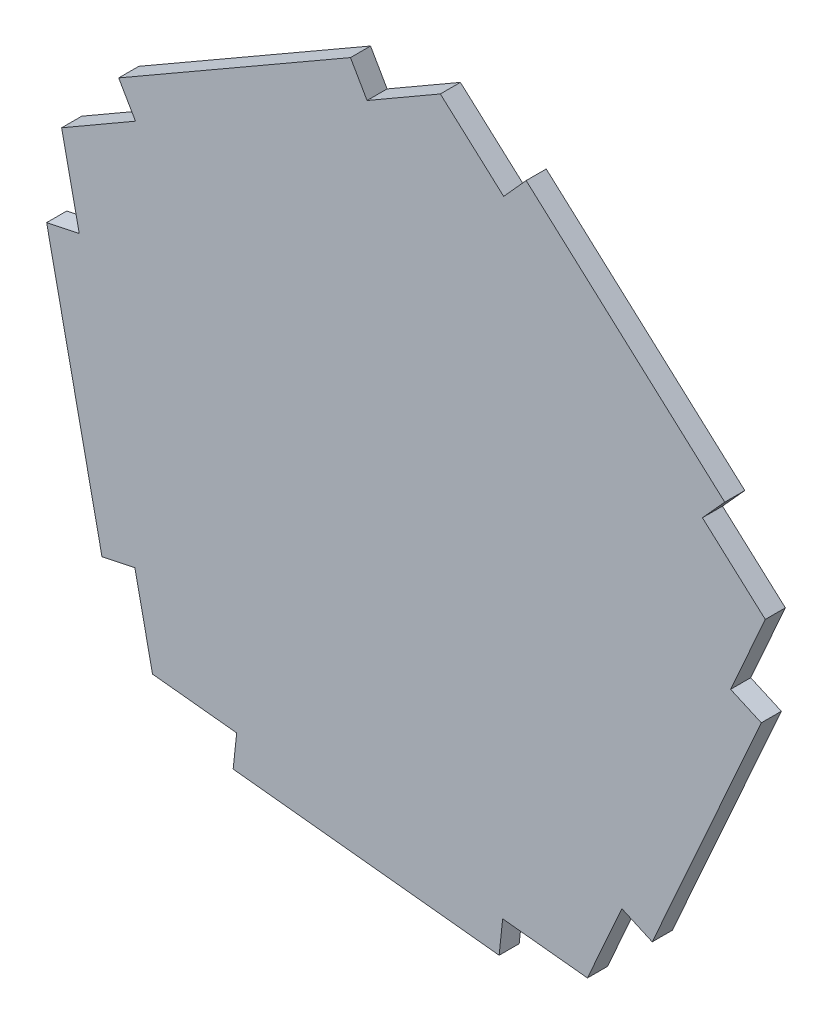
ISO-10303-21;
HEADER;
FILE_DESCRIPTION(('STEP AP214'),'2;1');
FILE_NAME('part.step','',(''),(''),'','','');
FILE_SCHEMA(('AUTOMOTIVE_DESIGN { 1 0 10303 214 1 1 1 1 }'));
ENDSEC;
DATA;
#1=APPLICATION_CONTEXT('core data for automotive mechanical design processes');
#2=APPLICATION_PROTOCOL_DEFINITION('international standard','automotive_design',2000,#1);
#3=PRODUCT_CONTEXT('',#1,'mechanical');
#4=PRODUCT('Part','Part','',(#3));
#5=PRODUCT_RELATED_PRODUCT_CATEGORY('part','',(#4));
#6=PRODUCT_DEFINITION_FORMATION('','',#4);
#7=PRODUCT_DEFINITION_CONTEXT('part definition',#1,'design');
#8=PRODUCT_DEFINITION('design','',#6,#7);
#9=PRODUCT_DEFINITION_SHAPE('','',#8);
#10=(LENGTH_UNIT() NAMED_UNIT(*) SI_UNIT(.MILLI.,.METRE.));
#11=(NAMED_UNIT(*) PLANE_ANGLE_UNIT() SI_UNIT($,.RADIAN.));
#12=(NAMED_UNIT(*) SI_UNIT($,.STERADIAN.) SOLID_ANGLE_UNIT());
#13=UNCERTAINTY_MEASURE_WITH_UNIT(LENGTH_MEASURE(1.E-05),#10,'distance_accuracy_value','');
#14=(GEOMETRIC_REPRESENTATION_CONTEXT(3) GLOBAL_UNCERTAINTY_ASSIGNED_CONTEXT((#13)) GLOBAL_UNIT_ASSIGNED_CONTEXT((#10,
#11,#12)) REPRESENTATION_CONTEXT('',''));
#15=CARTESIAN_POINT('',(0.,0.,0.));
#16=DIRECTION('',(0.,0.,1.));
#17=DIRECTION('',(1.,0.,0.));
#18=AXIS2_PLACEMENT_3D('',#15,#16,#17);
#19=CARTESIAN_POINT('',(60.4666560497849,12.7845069775127,3.));
#20=DIRECTION('',(-0.669930916936088,-0.742423441529948,0.));
#21=DIRECTION('',(0.742423441529948,-0.669930916936088,0.));
#22=AXIS2_PLACEMENT_3D('',#19,#20,#21);
#23=PLANE('',#22);
#24=DIRECTION('',(-0.742423441529948,0.669930916936088,0.));
#25=VECTOR('',#24,1.);
#26=CARTESIAN_POINT('',(60.4666560497849,12.7845069775127,3.));
#27=LINE('',#26,#25);
#28=CARTESIAN_POINT('',(48.3450146774038,23.7225537377753,3.));
#29=VERTEX_POINT('',#28);
#30=CARTESIAN_POINT('',(18.6480770162058,50.5197904152189,3.));
#31=VERTEX_POINT('',#30);
#32=EDGE_CURVE('E230',#29,#31,#27,.T.);
#33=ORIENTED_EDGE('',*,*,#32,.F.);
#34=DIRECTION('',(0.,0.,1.));
#35=VECTOR('',#34,1.);
#36=CARTESIAN_POINT('',(48.3450146774038,23.7225537377753,-7.));
#37=LINE('',#36,#35);
#38=CARTESIAN_POINT('',(48.3450146774038,23.7225537377753,0.));
#39=VERTEX_POINT('',#38);
#40=EDGE_CURVE('E393',#39,#29,#37,.T.);
#41=ORIENTED_EDGE('',*,*,#40,.F.);
#42=DIRECTION('',(-0.742423441529948,0.669930916936088,0.));
#43=VECTOR('',#42,1.);
#44=CARTESIAN_POINT('',(60.4666560497849,12.7845069775127,0.));
#45=LINE('',#44,#43);
#46=CARTESIAN_POINT('',(18.6480770162058,50.5197904152189,0.));
#47=VERTEX_POINT('',#46);
#48=EDGE_CURVE('E245',#39,#47,#45,.T.);
#49=ORIENTED_EDGE('',*,*,#48,.T.);
#50=DIRECTION('',(0.,0.,1.));
#51=VECTOR('',#50,1.);
#52=CARTESIAN_POINT('',(18.6480770162058,50.5197904152189,-7.));
#53=LINE('',#52,#51);
#54=EDGE_CURVE('E338',#47,#31,#53,.T.);
#55=ORIENTED_EDGE('',*,*,#54,.T.);
#56=EDGE_LOOP('',(#33,#41,#49,#55));
#57=FACE_BOUND('',#56,.T.);
#58=ADVANCED_FACE('F36',(#57),#23,.F.);
#59=CARTESIAN_POINT('',(6.52643564382398,61.4578371754822,3.));
#60=DIRECTION('',(0.499066613526888,-0.866563624474743,0.));
#61=DIRECTION('',(0.866563624474743,0.499066613526888,0.));
#62=AXIS2_PLACEMENT_3D('',#59,#60,#61);
#63=PLANE('',#62);
#64=DIRECTION('',(-0.866563624474743,-0.499066613526888,0.));
#65=VECTOR('',#64,1.);
#66=CARTESIAN_POINT('',(6.52643564382398,61.4578371754822,3.));
#67=LINE('',#66,#65);
#68=CARTESIAN_POINT('',(-7.62205818684922,53.3095134942752,3.));
#69=VERTEX_POINT('',#68);
#70=CARTESIAN_POINT('',(-42.2846031658391,33.3468489531995,3.));
#71=VERTEX_POINT('',#70);
#72=EDGE_CURVE('E220',#69,#71,#67,.T.);
#73=ORIENTED_EDGE('',*,*,#72,.F.);
#74=DIRECTION('',(0.,0.,1.));
#75=VECTOR('',#74,1.);
#76=CARTESIAN_POINT('',(-7.62205818684922,53.3095134942752,-7.));
#77=LINE('',#76,#75);
#78=CARTESIAN_POINT('',(-7.62205818684922,53.3095134942752,0.));
#79=VERTEX_POINT('',#78);
#80=EDGE_CURVE('E201',#79,#69,#77,.T.);
#81=ORIENTED_EDGE('',*,*,#80,.F.);
#82=DIRECTION('',(-0.866563624474743,-0.499066613526888,0.));
#83=VECTOR('',#82,1.);
#84=CARTESIAN_POINT('',(6.52643564382398,61.4578371754822,0.));
#85=LINE('',#84,#83);
#86=CARTESIAN_POINT('',(-42.2846031658391,33.3468489531995,0.));
#87=VERTEX_POINT('',#86);
#88=EDGE_CURVE('E248',#79,#87,#85,.T.);
#89=ORIENTED_EDGE('',*,*,#88,.T.);
#90=DIRECTION('',(0.,0.,1.));
#91=VECTOR('',#90,1.);
#92=CARTESIAN_POINT('',(-42.2846031658391,33.3468489531995,-7.));
#93=LINE('',#92,#91);
#94=EDGE_CURVE('E228',#87,#71,#93,.T.);
#95=ORIENTED_EDGE('',*,*,#94,.T.);
#96=EDGE_LOOP('',(#73,#81,#89,#95));
#97=FACE_BOUND('',#96,.T.);
#98=ADVANCED_FACE('F227',(#97),#63,.F.);
#99=CARTESIAN_POINT('',(-56.4330969965129,25.1985252719922,3.));
#100=DIRECTION('',(0.978371046746013,0.206857668190257,0.));
#101=DIRECTION('',(-0.206857668190257,0.978371046746013,0.));
#102=AXIS2_PLACEMENT_3D('',#99,#100,#101);
#103=PLANE('',#102);
#104=DIRECTION('',(0.,0.,1.));
#105=VECTOR('',#104,1.);
#106=CARTESIAN_POINT('',(-44.7813989734956,-29.910304344433,-7.));
#107=LINE('',#106,#105);
#108=CARTESIAN_POINT('',(-44.7813989734956,-29.910304344433,0.));
#109=VERTEX_POINT('',#108);
#110=CARTESIAN_POINT('',(-44.7813989734956,-29.910304344433,3.));
#111=VERTEX_POINT('',#110);
#112=EDGE_CURVE('E363',#109,#111,#107,.T.);
#113=ORIENTED_EDGE('',*,*,#112,.T.);
#114=DIRECTION('',(0.206857668190257,-0.978371046746013,0.));
#115=VECTOR('',#114,1.);
#116=CARTESIAN_POINT('',(-56.4330969965129,25.1985252719922,3.));
#117=LINE('',#116,#115);
#118=CARTESIAN_POINT('',(-53.0557057011059,9.22453752540768,3.));
#119=VERTEX_POINT('',#118);
#120=EDGE_CURVE('E229',#119,#111,#117,.T.);
#121=ORIENTED_EDGE('',*,*,#120,.F.);
#122=DIRECTION('',(0.,0.,1.));
#123=VECTOR('',#122,1.);
#124=CARTESIAN_POINT('',(-53.0557057011059,9.22453752540768,-7.));
#125=LINE('',#124,#123);
#126=CARTESIAN_POINT('',(-53.0557057011059,9.22453752540768,0.));
#127=VERTEX_POINT('',#126);
#128=EDGE_CURVE('E346',#127,#119,#125,.T.);
#129=ORIENTED_EDGE('',*,*,#128,.F.);
#130=DIRECTION('',(0.206857668190257,-0.978371046746013,0.));
#131=VECTOR('',#130,1.);
#132=CARTESIAN_POINT('',(-56.4330969965129,25.1985252719922,0.));
#133=LINE('',#132,#131);
#134=EDGE_CURVE('E250',#127,#109,#133,.T.);
#135=ORIENTED_EDGE('',*,*,#134,.T.);
#136=EDGE_LOOP('',(#113,#121,#129,#135));
#137=FACE_BOUND('',#136,.T.);
#138=ADVANCED_FACE('F362',(#137),#103,.F.);
#139=CARTESIAN_POINT('',(-41.4040076780885,-45.8842920910178,3.));
#140=DIRECTION('',(0.10559994697096,0.99440869424987,0.));
#141=DIRECTION('',(-0.99440869424987,0.10559994697096,0.));
#142=AXIS2_PLACEMENT_3D('',#139,#140,#141);
#143=PLANE('',#142);
#144=DIRECTION('',(0.994408694249869,-0.10559994697096,0.));
#145=VECTOR('',#144,1.);
#146=CARTESIAN_POINT('',(-41.4040076780885,-45.8842920910178,3.));
#147=LINE('',#146,#145);
#148=CARTESIAN_POINT('',(-25.1681712335455,-47.6084357730743,3.));
#149=VERTEX_POINT('',#148);
#150=CARTESIAN_POINT('',(14.6081765364494,-51.8324336519127,3.));
#151=VERTEX_POINT('',#150);
#152=EDGE_CURVE('E232',#149,#151,#147,.T.);
#153=ORIENTED_EDGE('',*,*,#152,.F.);
#154=DIRECTION('',(0.,0.,1.));
#155=VECTOR('',#154,1.);
#156=CARTESIAN_POINT('',(-25.1681712335455,-47.6084357730743,-7.));
#157=LINE('',#156,#155);
#158=CARTESIAN_POINT('',(-25.1681712335455,-47.6084357730743,0.));
#159=VERTEX_POINT('',#158);
#160=EDGE_CURVE('E321',#159,#149,#157,.T.);
#161=ORIENTED_EDGE('',*,*,#160,.F.);
#162=DIRECTION('',(0.994408694249869,-0.10559994697096,0.));
#163=VECTOR('',#162,1.);
#164=CARTESIAN_POINT('',(-41.4040076780885,-45.8842920910178,0.));
#165=LINE('',#164,#163);
#166=CARTESIAN_POINT('',(14.6081765364494,-51.8324336519127,0.));
#167=VERTEX_POINT('',#166);
#168=EDGE_CURVE('E253',#159,#167,#165,.T.);
#169=ORIENTED_EDGE('',*,*,#168,.T.);
#170=DIRECTION('',(0.,0.,1.));
#171=VECTOR('',#170,1.);
#172=CARTESIAN_POINT('',(14.6081765364494,-51.8324336519127,-7.));
#173=LINE('',#172,#171);
#174=EDGE_CURVE('E383',#167,#151,#173,.T.);
#175=ORIENTED_EDGE('',*,*,#174,.T.);
#176=EDGE_LOOP('',(#153,#161,#169,#175));
#177=FACE_BOUND('',#176,.T.);
#178=ADVANCED_FACE('F325',(#177),#143,.F.);
#179=CARTESIAN_POINT('',(30.8440129809925,-53.5565773339692,3.));
#180=DIRECTION('',(-0.913106690307773,0.407720703564565,0.));
#181=DIRECTION('',(-0.407720703564565,-0.913106690307773,0.));
#182=AXIS2_PLACEMENT_3D('',#179,#180,#181);
#183=PLANE('',#182);
#184=DIRECTION('',(0.407720703564565,0.913106690307773,0.));
#185=VECTOR('',#184,1.);
#186=CARTESIAN_POINT('',(30.8440129809925,-53.5565773339692,3.));
#187=LINE('',#186,#185);
#188=CARTESIAN_POINT('',(37.5009204440974,-38.6481689843837,3.));
#189=VERTEX_POINT('',#188);
#190=CARTESIAN_POINT('',(53.8097485866798,-2.1239013720733,3.));
#191=VERTEX_POINT('',#190);
#192=EDGE_CURVE('E241',#189,#191,#187,.T.);
#193=ORIENTED_EDGE('',*,*,#192,.F.);
#194=DIRECTION('',(0.,0.,1.));
#195=VECTOR('',#194,1.);
#196=CARTESIAN_POINT('',(37.5009204440974,-38.6481689843837,-7.));
#197=LINE('',#196,#195);
#198=CARTESIAN_POINT('',(37.5009204440974,-38.6481689843837,0.));
#199=VERTEX_POINT('',#198);
#200=EDGE_CURVE('E375',#199,#189,#197,.T.);
#201=ORIENTED_EDGE('',*,*,#200,.F.);
#202=DIRECTION('',(0.407720703564565,0.913106690307773,0.));
#203=VECTOR('',#202,1.);
#204=CARTESIAN_POINT('',(30.8440129809925,-53.5565773339692,0.));
#205=LINE('',#204,#203);
#206=CARTESIAN_POINT('',(53.8097485866798,-2.1239013720733,0.));
#207=VERTEX_POINT('',#206);
#208=EDGE_CURVE('E235',#199,#207,#205,.T.);
#209=ORIENTED_EDGE('',*,*,#208,.T.);
#210=DIRECTION('',(0.,0.,1.));
#211=VECTOR('',#210,1.);
#212=CARTESIAN_POINT('',(53.8097485866798,-2.1239013720733,-7.));
#213=LINE('',#212,#211);
#214=EDGE_CURVE('E224',#207,#191,#213,.T.);
#215=ORIENTED_EDGE('',*,*,#214,.T.);
#216=EDGE_LOOP('',(#193,#201,#209,#215));
#217=FACE_BOUND('',#216,.T.);
#218=ADVANCED_FACE('F463',(#217),#183,.F.);
#219=CARTESIAN_POINT('',(0.,0.,3.));
#220=DIRECTION('',(0.,0.,1.));
#221=DIRECTION('',(1.,0.,0.));
#222=AXIS2_PLACEMENT_3D('',#219,#220,#221);
#223=PLANE('',#222);
#224=ORIENTED_EDGE('',*,*,#120,.T.);
#225=DIRECTION('',(0.978147600733805,0.207911690817762,0.));
#226=VECTOR('',#225,1.);
#227=CARTESIAN_POINT('',(4.14703071402629,-19.5102455621397,3.));
#228=LINE('',#227,#226);
#229=CARTESIAN_POINT('',(-39.8696113189949,-28.866271648939,3.));
#230=VERTEX_POINT('',#229);
#231=EDGE_CURVE('E327',#111,#230,#228,.T.);
#232=ORIENTED_EDGE('',*,*,#231,.T.);
#233=DIRECTION('',(0.207911690817767,-0.978147600733804,0.));
#234=VECTOR('',#233,1.);
#235=CARTESIAN_POINT('',(-44.0166420330212,-9.35602608679955,3.));
#236=LINE('',#235,#234);
#237=CARTESIAN_POINT('',(-37.2190911878338,-41.3359884637777,3.));
#238=VERTEX_POINT('',#237);
#239=EDGE_CURVE('E331',#230,#238,#236,.T.);
#240=ORIENTED_EDGE('',*,*,#239,.T.);
#241=DIRECTION('',(0.994521895368274,-0.104528463267646,0.));
#242=VECTOR('',#241,1.);
#243=CARTESIAN_POINT('',(-4.70378084704407,-44.7534852915723,3.));
#244=LINE('',#243,#242);
#245=CARTESIAN_POINT('',(-24.6371152090422,-42.6584074271596,3.));
#246=VERTEX_POINT('',#245);
#247=EDGE_CURVE('E313',#238,#246,#244,.T.);
#248=ORIENTED_EDGE('',*,*,#247,.T.);
#249=DIRECTION('',(0.10667130808416,0.994294338730546,0.));
#250=VECTOR('',#249,1.);
#251=CARTESIAN_POINT('',(-19.8323102721156,2.12767829067446,3.));
#252=LINE('',#251,#250);
#253=EDGE_CURVE('E373',#149,#246,#252,.T.);
#254=ORIENTED_EDGE('',*,*,#253,.F.);
#255=ORIENTED_EDGE('',*,*,#152,.T.);
#256=DIRECTION('',(0.104528463267647,0.994521895368274,0.));
#257=VECTOR('',#256,1.);
#258=CARTESIAN_POINT('',(19.8368491432206,-2.08493685927865,3.));
#259=LINE('',#258,#257);
#260=CARTESIAN_POINT('',(15.1330682961764,-46.838422150851,3.));
#261=VERTEX_POINT('',#260);
#262=EDGE_CURVE('E377',#151,#261,#259,.T.);
#263=ORIENTED_EDGE('',*,*,#262,.T.);
#264=DIRECTION('',(0.994521895368274,-0.104528463267646,0.));
#265=VECTOR('',#264,1.);
#266=CARTESIAN_POINT('',(-4.70378084704407,-44.7534852915723,3.));
#267=LINE('',#266,#265);
#268=CARTESIAN_POINT('',(27.8115294937456,-48.1709821193669,3.));
#269=VERTEX_POINT('',#268);
#270=EDGE_CURVE('E388',#261,#269,#267,.T.);
#271=ORIENTED_EDGE('',*,*,#270,.T.);
#272=DIRECTION('',(0.406736643075794,0.913545457642604,0.));
#273=VECTOR('',#272,1.);
#274=CARTESIAN_POINT('',(41.1095455939172,-18.3031489384107,3.));
#275=LINE('',#274,#273);
#276=CARTESIAN_POINT('',(32.9572690664063,-36.6134618102367,3.));
#277=VERTEX_POINT('',#276);
#278=EDGE_CURVE('E367',#269,#277,#275,.T.);
#279=ORIENTED_EDGE('',*,*,#278,.T.);
#280=DIRECTION('',(-0.912666862954857,0.408704290733705,0.));
#281=VECTOR('',#280,1.);
#282=CARTESIAN_POINT('',(-8.15206321472618,-18.2041591671018,3.));
#283=LINE('',#282,#281);
#284=EDGE_CURVE('E365',#189,#277,#283,.T.);
#285=ORIENTED_EDGE('',*,*,#284,.F.);
#286=ORIENTED_EDGE('',*,*,#192,.T.);
#287=DIRECTION('',(-0.913545457642599,0.406736643075804,0.));
#288=VECTOR('',#287,1.);
#289=CARTESIAN_POINT('',(8.11281628618838,18.2216837187079,3.));
#290=LINE('',#289,#288);
#291=CARTESIAN_POINT('',(49.2223618801051,-0.0814652197031907,3.));
#292=VERTEX_POINT('',#291);
#293=EDGE_CURVE('E396',#191,#292,#290,.T.);
#294=ORIENTED_EDGE('',*,*,#293,.T.);
#295=DIRECTION('',(0.406736643075794,0.913545457642604,0.));
#296=VECTOR('',#295,1.);
#297=CARTESIAN_POINT('',(41.1095455939172,-18.3031489384107,3.));
#298=LINE('',#297,#296);
#299=CARTESIAN_POINT('',(54.4075616940888,11.5646842425456,3.));
#300=VERTEX_POINT('',#299);
#301=EDGE_CURVE('E406',#292,#300,#298,.T.);
#302=ORIENTED_EDGE('',*,*,#301,.T.);
#303=DIRECTION('',(-0.7431448254774,0.669130606358852,0.));
#304=VECTOR('',#303,1.);
#305=CARTESIAN_POINT('',(30.1108772861484,33.441517146483,3.));
#306=LINE('',#305,#304);
#307=CARTESIAN_POINT('',(45.0058276684571,20.0300435826368,3.));
#308=VERTEX_POINT('',#307);
#309=EDGE_CURVE('E409',#300,#308,#306,.T.);
#310=ORIENTED_EDGE('',*,*,#309,.T.);
#311=DIRECTION('',(-0.670730449796009,-0.741701195709191,0.));
#312=VECTOR('',#311,1.);
#313=CARTESIAN_POINT('',(14.794058126977,-13.3784673925565,3.));
#314=LINE('',#313,#312);
#315=EDGE_CURVE('E385',#29,#308,#314,.T.);
#316=ORIENTED_EDGE('',*,*,#315,.F.);
#317=ORIENTED_EDGE('',*,*,#32,.T.);
#318=DIRECTION('',(-0.66913060635886,-0.743144825477393,0.));
#319=VECTOR('',#318,1.);
#320=CARTESIAN_POINT('',(-14.8228529338725,13.3465567296909,3.));
#321=LINE('',#320,#319);
#322=CARTESIAN_POINT('',(15.2880243522761,46.7880738761735,3.));
#323=VERTEX_POINT('',#322);
#324=EDGE_CURVE('E213',#31,#323,#321,.T.);
#325=ORIENTED_EDGE('',*,*,#324,.T.);
#326=DIRECTION('',(-0.7431448254774,0.669130606358852,0.));
#327=VECTOR('',#326,1.);
#328=CARTESIAN_POINT('',(30.1108772861484,33.441517146483,3.));
#329=LINE('',#328,#327);
#330=CARTESIAN_POINT('',(5.81419287820799,55.3183500504205,3.));
#331=VERTEX_POINT('',#330);
#332=EDGE_CURVE('E423',#323,#331,#329,.T.);
#333=ORIENTED_EDGE('',*,*,#332,.T.);
#334=DIRECTION('',(-0.866025403784434,-0.500000000000007,0.));
#335=VECTOR('',#334,1.);
#336=CARTESIAN_POINT('',(-22.5000000000004,38.9711431702996,3.));
#337=LINE('',#336,#335);
#338=CARTESIAN_POINT('',(-5.14213787547932,48.9927095404484,3.));
#339=VERTEX_POINT('',#338);
#340=EDGE_CURVE('E223',#331,#339,#337,.T.);
#341=ORIENTED_EDGE('',*,*,#340,.T.);
#342=DIRECTION('',(0.498132647691415,-0.867100839178432,0.));
#343=VECTOR('',#342,1.);
#344=CARTESIAN_POINT('',(17.2952939687397,9.93581160111966,3.));
#345=LINE('',#344,#343);
#346=EDGE_CURVE('E204',#69,#339,#345,.T.);
#347=ORIENTED_EDGE('',*,*,#346,.F.);
#348=ORIENTED_EDGE('',*,*,#72,.T.);
#349=DIRECTION('',(0.5,-0.866025403784438,0.));
#350=VECTOR('',#349,1.);
#351=CARTESIAN_POINT('',(-17.2738432095626,-9.97305802698038,3.));
#352=LINE('',#351,#350);
#353=CARTESIAN_POINT('',(-39.7738432095626,28.9980851433193,3.));
#354=VERTEX_POINT('',#353);
#355=EDGE_CURVE('E344',#71,#354,#352,.T.);
#356=ORIENTED_EDGE('',*,*,#355,.T.);
#357=DIRECTION('',(-0.866025403784434,-0.500000000000007,0.));
#358=VECTOR('',#357,1.);
#359=CARTESIAN_POINT('',(-22.5000000000004,38.9711431702996,3.));
#360=LINE('',#359,#358);
#361=CARTESIAN_POINT('',(-50.8141928782087,22.6239362901787,3.));
#362=VERTEX_POINT('',#361);
#363=EDGE_CURVE('E341',#354,#362,#360,.T.);
#364=ORIENTED_EDGE('',*,*,#363,.T.);
#365=DIRECTION('',(0.207911690817767,-0.978147600733804,0.));
#366=VECTOR('',#365,1.);
#367=CARTESIAN_POINT('',(-44.0166420330212,-9.35602608679955,3.));
#368=LINE('',#367,#366);
#369=CARTESIAN_POINT('',(-48.1838436503414,10.2491161143113,3.));
#370=VERTEX_POINT('',#369);
#371=EDGE_CURVE('E337',#362,#370,#368,.T.);
#372=ORIENTED_EDGE('',*,*,#371,.T.);
#373=DIRECTION('',(0.978593356975279,0.205803405423368,0.));
#374=VECTOR('',#373,1.);
#375=CARTESIAN_POINT('',(-4.10497860887481,19.5191366678639,3.));
#376=LINE('',#375,#374);
#377=EDGE_CURVE('E334',#119,#370,#376,.T.);
#378=ORIENTED_EDGE('',*,*,#377,.F.);
#379=EDGE_LOOP('',(#224,#232,#240,#248,#254,#255,#263,#271,#279,#285,#286,#294,#302,#310,#316,
#317,#325,#333,#341,#347,#348,#356,#364,#372,#378));
#380=FACE_BOUND('',#379,.T.);
#381=ADVANCED_FACE('F218',(#380),#223,.T.);
#382=CARTESIAN_POINT('',(0.,0.,0.));
#383=DIRECTION('',(0.,0.,1.));
#384=DIRECTION('',(1.,0.,0.));
#385=AXIS2_PLACEMENT_3D('',#382,#383,#384);
#386=PLANE('',#385);
#387=DIRECTION('',(0.978147600733805,0.207911690817762,0.));
#388=VECTOR('',#387,1.);
#389=CARTESIAN_POINT('',(4.14703071402629,-19.5102455621397,0.));
#390=LINE('',#389,#388);
#391=CARTESIAN_POINT('',(-39.8696113189949,-28.866271648939,0.));
#392=VERTEX_POINT('',#391);
#393=EDGE_CURVE('E11',#109,#392,#390,.T.);
#394=ORIENTED_EDGE('',*,*,#393,.F.);
#395=ORIENTED_EDGE('',*,*,#134,.F.);
#396=DIRECTION('',(0.978593356975279,0.205803405423368,0.));
#397=VECTOR('',#396,1.);
#398=CARTESIAN_POINT('',(-4.10497860887481,19.5191366678639,0.));
#399=LINE('',#398,#397);
#400=CARTESIAN_POINT('',(-48.1838436503414,10.2491161143113,0.));
#401=VERTEX_POINT('',#400);
#402=EDGE_CURVE('E244',#127,#401,#399,.T.);
#403=ORIENTED_EDGE('',*,*,#402,.T.);
#404=DIRECTION('',(0.207911690817767,-0.978147600733804,0.));
#405=VECTOR('',#404,1.);
#406=CARTESIAN_POINT('',(-44.0166420330212,-9.35602608679955,0.));
#407=LINE('',#406,#405);
#408=CARTESIAN_POINT('',(-50.8141928782087,22.6239362901787,0.));
#409=VERTEX_POINT('',#408);
#410=EDGE_CURVE('E260',#409,#401,#407,.T.);
#411=ORIENTED_EDGE('',*,*,#410,.F.);
#412=DIRECTION('',(-0.866025403784434,-0.500000000000007,0.));
#413=VECTOR('',#412,1.);
#414=CARTESIAN_POINT('',(-22.5000000000004,38.9711431702996,0.));
#415=LINE('',#414,#413);
#416=CARTESIAN_POINT('',(-39.7738432095626,28.9980851433193,0.));
#417=VERTEX_POINT('',#416);
#418=EDGE_CURVE('E263',#417,#409,#415,.T.);
#419=ORIENTED_EDGE('',*,*,#418,.F.);
#420=DIRECTION('',(0.5,-0.866025403784438,0.));
#421=VECTOR('',#420,1.);
#422=CARTESIAN_POINT('',(-17.2738432095626,-9.97305802698038,0.));
#423=LINE('',#422,#421);
#424=EDGE_CURVE('E265',#87,#417,#423,.T.);
#425=ORIENTED_EDGE('',*,*,#424,.F.);
#426=ORIENTED_EDGE('',*,*,#88,.F.);
#427=DIRECTION('',(0.498132647691415,-0.867100839178432,0.));
#428=VECTOR('',#427,1.);
#429=CARTESIAN_POINT('',(17.2952939687397,9.93581160111966,0.));
#430=LINE('',#429,#428);
#431=CARTESIAN_POINT('',(-5.14213787547932,48.9927095404484,0.));
#432=VERTEX_POINT('',#431);
#433=EDGE_CURVE('E207',#79,#432,#430,.T.);
#434=ORIENTED_EDGE('',*,*,#433,.T.);
#435=DIRECTION('',(-0.866025403784434,-0.500000000000007,0.));
#436=VECTOR('',#435,1.);
#437=CARTESIAN_POINT('',(-22.5000000000004,38.9711431702996,0.));
#438=LINE('',#437,#436);
#439=CARTESIAN_POINT('',(5.81419287820799,55.3183500504205,0.));
#440=VERTEX_POINT('',#439);
#441=EDGE_CURVE('E268',#440,#432,#438,.T.);
#442=ORIENTED_EDGE('',*,*,#441,.F.);
#443=DIRECTION('',(-0.7431448254774,0.669130606358852,0.));
#444=VECTOR('',#443,1.);
#445=CARTESIAN_POINT('',(30.1108772861484,33.441517146483,0.));
#446=LINE('',#445,#444);
#447=CARTESIAN_POINT('',(15.2880243522761,46.7880738761735,0.));
#448=VERTEX_POINT('',#447);
#449=EDGE_CURVE('E271',#448,#440,#446,.T.);
#450=ORIENTED_EDGE('',*,*,#449,.F.);
#451=DIRECTION('',(-0.66913060635886,-0.743144825477393,0.));
#452=VECTOR('',#451,1.);
#453=CARTESIAN_POINT('',(-14.8228529338725,13.3465567296909,0.));
#454=LINE('',#453,#452);
#455=EDGE_CURVE('E273',#47,#448,#454,.T.);
#456=ORIENTED_EDGE('',*,*,#455,.F.);
#457=ORIENTED_EDGE('',*,*,#48,.F.);
#458=DIRECTION('',(-0.670730449796009,-0.741701195709191,0.));
#459=VECTOR('',#458,1.);
#460=CARTESIAN_POINT('',(14.794058126977,-13.3784673925565,0.));
#461=LINE('',#460,#459);
#462=CARTESIAN_POINT('',(45.0058276684571,20.0300435826368,0.));
#463=VERTEX_POINT('',#462);
#464=EDGE_CURVE('E275',#39,#463,#461,.T.);
#465=ORIENTED_EDGE('',*,*,#464,.T.);
#466=DIRECTION('',(-0.7431448254774,0.669130606358852,0.));
#467=VECTOR('',#466,1.);
#468=CARTESIAN_POINT('',(30.1108772861484,33.441517146483,0.));
#469=LINE('',#468,#467);
#470=CARTESIAN_POINT('',(54.4075616940888,11.5646842425456,0.));
#471=VERTEX_POINT('',#470);
#472=EDGE_CURVE('E278',#471,#463,#469,.T.);
#473=ORIENTED_EDGE('',*,*,#472,.F.);
#474=DIRECTION('',(0.406736643075794,0.913545457642604,0.));
#475=VECTOR('',#474,1.);
#476=CARTESIAN_POINT('',(41.1095455939172,-18.3031489384107,0.));
#477=LINE('',#476,#475);
#478=CARTESIAN_POINT('',(49.2223618801051,-0.0814652197031907,0.));
#479=VERTEX_POINT('',#478);
#480=EDGE_CURVE('E281',#479,#471,#477,.T.);
#481=ORIENTED_EDGE('',*,*,#480,.F.);
#482=DIRECTION('',(-0.913545457642599,0.406736643075804,0.));
#483=VECTOR('',#482,1.);
#484=CARTESIAN_POINT('',(8.11281628618838,18.2216837187079,0.));
#485=LINE('',#484,#483);
#486=EDGE_CURVE('E283',#207,#479,#485,.T.);
#487=ORIENTED_EDGE('',*,*,#486,.F.);
#488=ORIENTED_EDGE('',*,*,#208,.F.);
#489=DIRECTION('',(-0.912666862954857,0.408704290733705,0.));
#490=VECTOR('',#489,1.);
#491=CARTESIAN_POINT('',(-8.15206321472618,-18.2041591671018,0.));
#492=LINE('',#491,#490);
#493=CARTESIAN_POINT('',(32.9572690664063,-36.6134618102367,0.));
#494=VERTEX_POINT('',#493);
#495=EDGE_CURVE('E285',#199,#494,#492,.T.);
#496=ORIENTED_EDGE('',*,*,#495,.T.);
#497=DIRECTION('',(0.406736643075794,0.913545457642604,0.));
#498=VECTOR('',#497,1.);
#499=CARTESIAN_POINT('',(41.1095455939172,-18.3031489384107,0.));
#500=LINE('',#499,#498);
#501=CARTESIAN_POINT('',(27.8115294937456,-48.1709821193669,0.));
#502=VERTEX_POINT('',#501);
#503=EDGE_CURVE('E288',#502,#494,#500,.T.);
#504=ORIENTED_EDGE('',*,*,#503,.F.);
#505=DIRECTION('',(0.994521895368274,-0.104528463267646,0.));
#506=VECTOR('',#505,1.);
#507=CARTESIAN_POINT('',(-4.70378084704407,-44.7534852915723,0.));
#508=LINE('',#507,#506);
#509=CARTESIAN_POINT('',(15.1330682961764,-46.838422150851,0.));
#510=VERTEX_POINT('',#509);
#511=EDGE_CURVE('E290',#510,#502,#508,.T.);
#512=ORIENTED_EDGE('',*,*,#511,.F.);
#513=DIRECTION('',(0.104528463267647,0.994521895368274,0.));
#514=VECTOR('',#513,1.);
#515=CARTESIAN_POINT('',(19.8368491432206,-2.08493685927865,0.));
#516=LINE('',#515,#514);
#517=EDGE_CURVE('E292',#167,#510,#516,.T.);
#518=ORIENTED_EDGE('',*,*,#517,.F.);
#519=ORIENTED_EDGE('',*,*,#168,.F.);
#520=DIRECTION('',(0.10667130808416,0.994294338730546,0.));
#521=VECTOR('',#520,1.);
#522=CARTESIAN_POINT('',(-19.8323102721156,2.12767829067446,0.));
#523=LINE('',#522,#521);
#524=CARTESIAN_POINT('',(-24.6371152090422,-42.6584074271596,0.));
#525=VERTEX_POINT('',#524);
#526=EDGE_CURVE('E294',#159,#525,#523,.T.);
#527=ORIENTED_EDGE('',*,*,#526,.T.);
#528=DIRECTION('',(0.994521895368274,-0.104528463267646,0.));
#529=VECTOR('',#528,1.);
#530=CARTESIAN_POINT('',(-4.70378084704407,-44.7534852915723,0.));
#531=LINE('',#530,#529);
#532=CARTESIAN_POINT('',(-37.2190911878338,-41.3359884637777,0.));
#533=VERTEX_POINT('',#532);
#534=EDGE_CURVE('E297',#533,#525,#531,.T.);
#535=ORIENTED_EDGE('',*,*,#534,.F.);
#536=DIRECTION('',(0.207911690817767,-0.978147600733804,0.));
#537=VECTOR('',#536,1.);
#538=CARTESIAN_POINT('',(-44.0166420330212,-9.35602608679955,0.));
#539=LINE('',#538,#537);
#540=EDGE_CURVE('E43',#392,#533,#539,.T.);
#541=ORIENTED_EDGE('',*,*,#540,.F.);
#542=EDGE_LOOP('',(#394,#395,#403,#411,#419,#425,#426,#434,#442,#450,#456,#457,#465,#473,#481,
#487,#488,#496,#504,#512,#518,#519,#527,#535,#541));
#543=FACE_BOUND('',#542,.T.);
#544=ADVANCED_FACE('F316',(#543),#386,.F.);
#545=CARTESIAN_POINT('',(-17.2738432095626,-9.97305802698038,-7.));
#546=DIRECTION('',(-0.866025403784438,-0.5,0.));
#547=DIRECTION('',(0.5,-0.866025403784438,0.));
#548=AXIS2_PLACEMENT_3D('',#545,#546,#547);
#549=PLANE('',#548);
#550=ORIENTED_EDGE('',*,*,#424,.T.);
#551=DIRECTION('',(0.,0.,1.));
#552=VECTOR('',#551,1.);
#553=CARTESIAN_POINT('',(-39.7738432095626,28.9980851433193,-7.));
#554=LINE('',#553,#552);
#555=EDGE_CURVE('E348',#417,#354,#554,.T.);
#556=ORIENTED_EDGE('',*,*,#555,.T.);
#557=ORIENTED_EDGE('',*,*,#355,.F.);
#558=ORIENTED_EDGE('',*,*,#94,.F.);
#559=EDGE_LOOP('',(#550,#556,#557,#558));
#560=FACE_BOUND('',#559,.T.);
#561=ADVANCED_FACE('F439',(#560),#549,.T.);
#562=CARTESIAN_POINT('',(-22.5000000000004,38.9711431702996,-7.));
#563=DIRECTION('',(-0.500000000000007,0.866025403784434,0.));
#564=DIRECTION('',(-0.866025403784434,-0.500000000000007,0.));
#565=AXIS2_PLACEMENT_3D('',#562,#563,#564);
#566=PLANE('',#565);
#567=ORIENTED_EDGE('',*,*,#418,.T.);
#568=DIRECTION('',(0.,0.,1.));
#569=VECTOR('',#568,1.);
#570=CARTESIAN_POINT('',(-50.8141928782087,22.6239362901787,-7.));
#571=LINE('',#570,#569);
#572=EDGE_CURVE('E350',#409,#362,#571,.T.);
#573=ORIENTED_EDGE('',*,*,#572,.T.);
#574=ORIENTED_EDGE('',*,*,#363,.F.);
#575=ORIENTED_EDGE('',*,*,#555,.F.);
#576=EDGE_LOOP('',(#567,#573,#574,#575));
#577=FACE_BOUND('',#576,.T.);
#578=ADVANCED_FACE('F442',(#577),#566,.T.);
#579=CARTESIAN_POINT('',(-44.0166420330212,-9.35602608679955,-7.));
#580=DIRECTION('',(-0.978147600733804,-0.207911690817767,0.));
#581=DIRECTION('',(0.207911690817767,-0.978147600733804,0.));
#582=AXIS2_PLACEMENT_3D('',#579,#580,#581);
#583=PLANE('',#582);
#584=ORIENTED_EDGE('',*,*,#410,.T.);
#585=DIRECTION('',(0.,0.,1.));
#586=VECTOR('',#585,1.);
#587=CARTESIAN_POINT('',(-48.1838436503414,10.2491161143113,-7.));
#588=LINE('',#587,#586);
#589=EDGE_CURVE('E352',#401,#370,#588,.T.);
#590=ORIENTED_EDGE('',*,*,#589,.T.);
#591=ORIENTED_EDGE('',*,*,#371,.F.);
#592=ORIENTED_EDGE('',*,*,#572,.F.);
#593=EDGE_LOOP('',(#584,#590,#591,#592));
#594=FACE_BOUND('',#593,.T.);
#595=ADVANCED_FACE('F445',(#594),#583,.T.);
#596=CARTESIAN_POINT('',(-4.10497860887481,19.5191366678639,-7.));
#597=DIRECTION('',(0.205803405423368,-0.978593356975279,0.));
#598=DIRECTION('',(0.978593356975279,0.205803405423368,0.));
#599=AXIS2_PLACEMENT_3D('',#596,#597,#598);
#600=PLANE('',#599);
#601=ORIENTED_EDGE('',*,*,#128,.T.);
#602=ORIENTED_EDGE('',*,*,#377,.T.);
#603=ORIENTED_EDGE('',*,*,#589,.F.);
#604=ORIENTED_EDGE('',*,*,#402,.F.);
#605=EDGE_LOOP('',(#601,#602,#603,#604));
#606=FACE_BOUND('',#605,.T.);
#607=ADVANCED_FACE('F356',(#606),#600,.F.);
#608=CARTESIAN_POINT('',(-14.8228529338725,13.3465567296909,-7.));
#609=DIRECTION('',(-0.743144825477393,0.66913060635886,0.));
#610=DIRECTION('',(-0.66913060635886,-0.743144825477393,0.));
#611=AXIS2_PLACEMENT_3D('',#608,#609,#610);
#612=PLANE('',#611);
#613=ORIENTED_EDGE('',*,*,#455,.T.);
#614=DIRECTION('',(0.,0.,1.));
#615=VECTOR('',#614,1.);
#616=CARTESIAN_POINT('',(15.2880243522761,46.7880738761735,-7.));
#617=LINE('',#616,#615);
#618=EDGE_CURVE('E417',#448,#323,#617,.T.);
#619=ORIENTED_EDGE('',*,*,#618,.T.);
#620=ORIENTED_EDGE('',*,*,#324,.F.);
#621=ORIENTED_EDGE('',*,*,#54,.F.);
#622=EDGE_LOOP('',(#613,#619,#620,#621));
#623=FACE_BOUND('',#622,.T.);
#624=ADVANCED_FACE('F486',(#623),#612,.T.);
#625=CARTESIAN_POINT('',(30.1108772861484,33.441517146483,-7.));
#626=DIRECTION('',(0.669130606358852,0.7431448254774,0.));
#627=DIRECTION('',(-0.7431448254774,0.669130606358852,0.));
#628=AXIS2_PLACEMENT_3D('',#625,#626,#627);
#629=PLANE('',#628);
#630=ORIENTED_EDGE('',*,*,#449,.T.);
#631=DIRECTION('',(0.,0.,1.));
#632=VECTOR('',#631,1.);
#633=CARTESIAN_POINT('',(5.81419287820799,55.3183500504205,-7.));
#634=LINE('',#633,#632);
#635=EDGE_CURVE('E415',#440,#331,#634,.T.);
#636=ORIENTED_EDGE('',*,*,#635,.T.);
#637=ORIENTED_EDGE('',*,*,#332,.F.);
#638=ORIENTED_EDGE('',*,*,#618,.F.);
#639=EDGE_LOOP('',(#630,#636,#637,#638));
#640=FACE_BOUND('',#639,.T.);
#641=ADVANCED_FACE('F428',(#640),#629,.T.);
#642=CARTESIAN_POINT('',(-22.5000000000004,38.9711431702996,-7.));
#643=DIRECTION('',(-0.500000000000007,0.866025403784434,0.));
#644=DIRECTION('',(-0.866025403784434,-0.500000000000007,0.));
#645=AXIS2_PLACEMENT_3D('',#642,#643,#644);
#646=PLANE('',#645);
#647=ORIENTED_EDGE('',*,*,#441,.T.);
#648=DIRECTION('',(0.,0.,1.));
#649=VECTOR('',#648,1.);
#650=CARTESIAN_POINT('',(-5.14213787547932,48.9927095404484,-7.));
#651=LINE('',#650,#649);
#652=EDGE_CURVE('E212',#432,#339,#651,.T.);
#653=ORIENTED_EDGE('',*,*,#652,.T.);
#654=ORIENTED_EDGE('',*,*,#340,.F.);
#655=ORIENTED_EDGE('',*,*,#635,.F.);
#656=EDGE_LOOP('',(#647,#653,#654,#655));
#657=FACE_BOUND('',#656,.T.);
#658=ADVANCED_FACE('F433',(#657),#646,.T.);
#659=CARTESIAN_POINT('',(17.2952939687397,9.93581160111966,-7.));
#660=DIRECTION('',(-0.867100839178432,-0.498132647691415,0.));
#661=DIRECTION('',(0.498132647691415,-0.867100839178432,0.));
#662=AXIS2_PLACEMENT_3D('',#659,#660,#661);
#663=PLANE('',#662);
#664=ORIENTED_EDGE('',*,*,#80,.T.);
#665=ORIENTED_EDGE('',*,*,#346,.T.);
#666=ORIENTED_EDGE('',*,*,#652,.F.);
#667=ORIENTED_EDGE('',*,*,#433,.F.);
#668=EDGE_LOOP('',(#664,#665,#666,#667));
#669=FACE_BOUND('',#668,.T.);
#670=ADVANCED_FACE('F203',(#669),#663,.F.);
#671=CARTESIAN_POINT('',(8.11281628618838,18.2216837187079,-7.));
#672=DIRECTION('',(0.406736643075804,0.913545457642599,0.));
#673=DIRECTION('',(-0.913545457642599,0.406736643075804,0.));
#674=AXIS2_PLACEMENT_3D('',#671,#672,#673);
#675=PLANE('',#674);
#676=ORIENTED_EDGE('',*,*,#486,.T.);
#677=DIRECTION('',(0.,0.,1.));
#678=VECTOR('',#677,1.);
#679=CARTESIAN_POINT('',(49.2223618801051,-0.0814652197031907,-7.));
#680=LINE('',#679,#678);
#681=EDGE_CURVE('E400',#479,#292,#680,.T.);
#682=ORIENTED_EDGE('',*,*,#681,.T.);
#683=ORIENTED_EDGE('',*,*,#293,.F.);
#684=ORIENTED_EDGE('',*,*,#214,.F.);
#685=EDGE_LOOP('',(#676,#682,#683,#684));
#686=FACE_BOUND('',#685,.T.);
#687=ADVANCED_FACE('F467',(#686),#675,.T.);
#688=CARTESIAN_POINT('',(41.1095455939172,-18.3031489384107,-7.));
#689=DIRECTION('',(0.913545457642604,-0.406736643075794,0.));
#690=DIRECTION('',(0.406736643075794,0.913545457642604,0.));
#691=AXIS2_PLACEMENT_3D('',#688,#689,#690);
#692=PLANE('',#691);
#693=ORIENTED_EDGE('',*,*,#480,.T.);
#694=DIRECTION('',(0.,0.,1.));
#695=VECTOR('',#694,1.);
#696=CARTESIAN_POINT('',(54.4075616940888,11.5646842425456,-7.));
#697=LINE('',#696,#695);
#698=EDGE_CURVE('E398',#471,#300,#697,.T.);
#699=ORIENTED_EDGE('',*,*,#698,.T.);
#700=ORIENTED_EDGE('',*,*,#301,.F.);
#701=ORIENTED_EDGE('',*,*,#681,.F.);
#702=EDGE_LOOP('',(#693,#699,#700,#701));
#703=FACE_BOUND('',#702,.T.);
#704=ADVANCED_FACE('F473',(#703),#692,.T.);
#705=CARTESIAN_POINT('',(30.1108772861484,33.441517146483,-7.));
#706=DIRECTION('',(0.669130606358852,0.7431448254774,0.));
#707=DIRECTION('',(-0.7431448254774,0.669130606358852,0.));
#708=AXIS2_PLACEMENT_3D('',#705,#706,#707);
#709=PLANE('',#708);
#710=ORIENTED_EDGE('',*,*,#472,.T.);
#711=DIRECTION('',(0.,0.,1.));
#712=VECTOR('',#711,1.);
#713=CARTESIAN_POINT('',(45.0058276684571,20.0300435826368,-7.));
#714=LINE('',#713,#712);
#715=EDGE_CURVE('E395',#463,#308,#714,.T.);
#716=ORIENTED_EDGE('',*,*,#715,.T.);
#717=ORIENTED_EDGE('',*,*,#309,.F.);
#718=ORIENTED_EDGE('',*,*,#698,.F.);
#719=EDGE_LOOP('',(#710,#716,#717,#718));
#720=FACE_BOUND('',#719,.T.);
#721=ADVANCED_FACE('F477',(#720),#709,.T.);
#722=CARTESIAN_POINT('',(14.794058126977,-13.3784673925565,-7.));
#723=DIRECTION('',(-0.741701195709191,0.670730449796009,0.));
#724=DIRECTION('',(-0.670730449796009,-0.741701195709191,0.));
#725=AXIS2_PLACEMENT_3D('',#722,#723,#724);
#726=PLANE('',#725);
#727=ORIENTED_EDGE('',*,*,#40,.T.);
#728=ORIENTED_EDGE('',*,*,#315,.T.);
#729=ORIENTED_EDGE('',*,*,#715,.F.);
#730=ORIENTED_EDGE('',*,*,#464,.F.);
#731=EDGE_LOOP('',(#727,#728,#729,#730));
#732=FACE_BOUND('',#731,.T.);
#733=ADVANCED_FACE('F487',(#732),#726,.F.);
#734=CARTESIAN_POINT('',(19.8368491432206,-2.08493685927865,-7.));
#735=DIRECTION('',(0.994521895368274,-0.104528463267647,0.));
#736=DIRECTION('',(0.104528463267647,0.994521895368274,0.));
#737=AXIS2_PLACEMENT_3D('',#734,#735,#736);
#738=PLANE('',#737);
#739=ORIENTED_EDGE('',*,*,#517,.T.);
#740=DIRECTION('',(0.,0.,1.));
#741=VECTOR('',#740,1.);
#742=CARTESIAN_POINT('',(15.1330682961764,-46.838422150851,-7.));
#743=LINE('',#742,#741);
#744=EDGE_CURVE('E381',#510,#261,#743,.T.);
#745=ORIENTED_EDGE('',*,*,#744,.T.);
#746=ORIENTED_EDGE('',*,*,#262,.F.);
#747=ORIENTED_EDGE('',*,*,#174,.F.);
#748=EDGE_LOOP('',(#739,#745,#746,#747));
#749=FACE_BOUND('',#748,.T.);
#750=ADVANCED_FACE('F449',(#749),#738,.T.);
#751=CARTESIAN_POINT('',(-4.70378084704407,-44.7534852915723,-7.));
#752=DIRECTION('',(-0.104528463267646,-0.994521895368274,0.));
#753=DIRECTION('',(0.994521895368274,-0.104528463267646,0.));
#754=AXIS2_PLACEMENT_3D('',#751,#752,#753);
#755=PLANE('',#754);
#756=ORIENTED_EDGE('',*,*,#511,.T.);
#757=DIRECTION('',(0.,0.,1.));
#758=VECTOR('',#757,1.);
#759=CARTESIAN_POINT('',(27.8115294937456,-48.1709821193669,-7.));
#760=LINE('',#759,#758);
#761=EDGE_CURVE('E379',#502,#269,#760,.T.);
#762=ORIENTED_EDGE('',*,*,#761,.T.);
#763=ORIENTED_EDGE('',*,*,#270,.F.);
#764=ORIENTED_EDGE('',*,*,#744,.F.);
#765=EDGE_LOOP('',(#756,#762,#763,#764));
#766=FACE_BOUND('',#765,.T.);
#767=ADVANCED_FACE('F453',(#766),#755,.T.);
#768=CARTESIAN_POINT('',(41.1095455939172,-18.3031489384107,-7.));
#769=DIRECTION('',(0.913545457642604,-0.406736643075794,0.));
#770=DIRECTION('',(0.406736643075794,0.913545457642604,0.));
#771=AXIS2_PLACEMENT_3D('',#768,#769,#770);
#772=PLANE('',#771);
#773=ORIENTED_EDGE('',*,*,#503,.T.);
#774=DIRECTION('',(0.,0.,1.));
#775=VECTOR('',#774,1.);
#776=CARTESIAN_POINT('',(32.9572690664063,-36.6134618102367,-7.));
#777=LINE('',#776,#775);
#778=EDGE_CURVE('E58',#494,#277,#777,.T.);
#779=ORIENTED_EDGE('',*,*,#778,.T.);
#780=ORIENTED_EDGE('',*,*,#278,.F.);
#781=ORIENTED_EDGE('',*,*,#761,.F.);
#782=EDGE_LOOP('',(#773,#779,#780,#781));
#783=FACE_BOUND('',#782,.T.);
#784=ADVANCED_FACE('F458',(#783),#772,.T.);
#785=CARTESIAN_POINT('',(-8.15206321472618,-18.2041591671018,-7.));
#786=DIRECTION('',(0.408704290733705,0.912666862954857,0.));
#787=DIRECTION('',(-0.912666862954857,0.408704290733705,0.));
#788=AXIS2_PLACEMENT_3D('',#785,#786,#787);
#789=PLANE('',#788);
#790=ORIENTED_EDGE('',*,*,#200,.T.);
#791=ORIENTED_EDGE('',*,*,#284,.T.);
#792=ORIENTED_EDGE('',*,*,#778,.F.);
#793=ORIENTED_EDGE('',*,*,#495,.F.);
#794=EDGE_LOOP('',(#790,#791,#792,#793));
#795=FACE_BOUND('',#794,.T.);
#796=ADVANCED_FACE('F529',(#795),#789,.F.);
#797=CARTESIAN_POINT('',(4.14703071402629,-19.5102455621397,-7.));
#798=DIRECTION('',(0.207911690817762,-0.978147600733805,0.));
#799=DIRECTION('',(0.978147600733805,0.207911690817762,0.));
#800=AXIS2_PLACEMENT_3D('',#797,#798,#799);
#801=PLANE('',#800);
#802=ORIENTED_EDGE('',*,*,#393,.T.);
#803=DIRECTION('',(0.,0.,1.));
#804=VECTOR('',#803,1.);
#805=CARTESIAN_POINT('',(-39.8696113189949,-28.866271648939,-7.));
#806=LINE('',#805,#804);
#807=EDGE_CURVE('E306',#392,#230,#806,.T.);
#808=ORIENTED_EDGE('',*,*,#807,.T.);
#809=ORIENTED_EDGE('',*,*,#231,.F.);
#810=ORIENTED_EDGE('',*,*,#112,.F.);
#811=EDGE_LOOP('',(#802,#808,#809,#810));
#812=FACE_BOUND('',#811,.T.);
#813=ADVANCED_FACE('F446',(#812),#801,.T.);
#814=CARTESIAN_POINT('',(-44.0166420330212,-9.35602608679955,-7.));
#815=DIRECTION('',(-0.978147600733804,-0.207911690817767,0.));
#816=DIRECTION('',(0.207911690817767,-0.978147600733804,0.));
#817=AXIS2_PLACEMENT_3D('',#814,#815,#816);
#818=PLANE('',#817);
#819=ORIENTED_EDGE('',*,*,#540,.T.);
#820=DIRECTION('',(0.,0.,1.));
#821=VECTOR('',#820,1.);
#822=CARTESIAN_POINT('',(-37.2190911878338,-41.3359884637777,-7.));
#823=LINE('',#822,#821);
#824=EDGE_CURVE('E304',#533,#238,#823,.T.);
#825=ORIENTED_EDGE('',*,*,#824,.T.);
#826=ORIENTED_EDGE('',*,*,#239,.F.);
#827=ORIENTED_EDGE('',*,*,#807,.F.);
#828=EDGE_LOOP('',(#819,#825,#826,#827));
#829=FACE_BOUND('',#828,.T.);
#830=ADVANCED_FACE('F302',(#829),#818,.T.);
#831=CARTESIAN_POINT('',(-4.70378084704407,-44.7534852915723,-7.));
#832=DIRECTION('',(-0.104528463267646,-0.994521895368274,0.));
#833=DIRECTION('',(0.994521895368274,-0.104528463267646,0.));
#834=AXIS2_PLACEMENT_3D('',#831,#832,#833);
#835=PLANE('',#834);
#836=ORIENTED_EDGE('',*,*,#534,.T.);
#837=DIRECTION('',(0.,0.,1.));
#838=VECTOR('',#837,1.);
#839=CARTESIAN_POINT('',(-24.6371152090422,-42.6584074271596,-7.));
#840=LINE('',#839,#838);
#841=EDGE_CURVE('E50',#525,#246,#840,.T.);
#842=ORIENTED_EDGE('',*,*,#841,.T.);
#843=ORIENTED_EDGE('',*,*,#247,.F.);
#844=ORIENTED_EDGE('',*,*,#824,.F.);
#845=EDGE_LOOP('',(#836,#842,#843,#844));
#846=FACE_BOUND('',#845,.T.);
#847=ADVANCED_FACE('F311',(#846),#835,.T.);
#848=CARTESIAN_POINT('',(-19.8323102721156,2.12767829067446,-7.));
#849=DIRECTION('',(0.994294338730546,-0.10667130808416,0.));
#850=DIRECTION('',(0.10667130808416,0.994294338730546,0.));
#851=AXIS2_PLACEMENT_3D('',#848,#849,#850);
#852=PLANE('',#851);
#853=ORIENTED_EDGE('',*,*,#160,.T.);
#854=ORIENTED_EDGE('',*,*,#253,.T.);
#855=ORIENTED_EDGE('',*,*,#841,.F.);
#856=ORIENTED_EDGE('',*,*,#526,.F.);
#857=EDGE_LOOP('',(#853,#854,#855,#856));
#858=FACE_BOUND('',#857,.T.);
#859=ADVANCED_FACE('F320',(#858),#852,.F.);
#860=CLOSED_SHELL('',(#58,#98,#138,#178,#218,#381,#544,#561,#578,#595,#607,#624,#641,#658,#670,
#687,#704,#721,#733,#750,#767,#784,#796,#813,#830,#847,#859));
#861=MANIFOLD_SOLID_BREP('B2',#860);
#862=ADVANCED_BREP_SHAPE_REPRESENTATION('',(#18,#861),#14);
#863=SHAPE_DEFINITION_REPRESENTATION(#9,#862);
ENDSEC;
END-ISO-10303-21;
